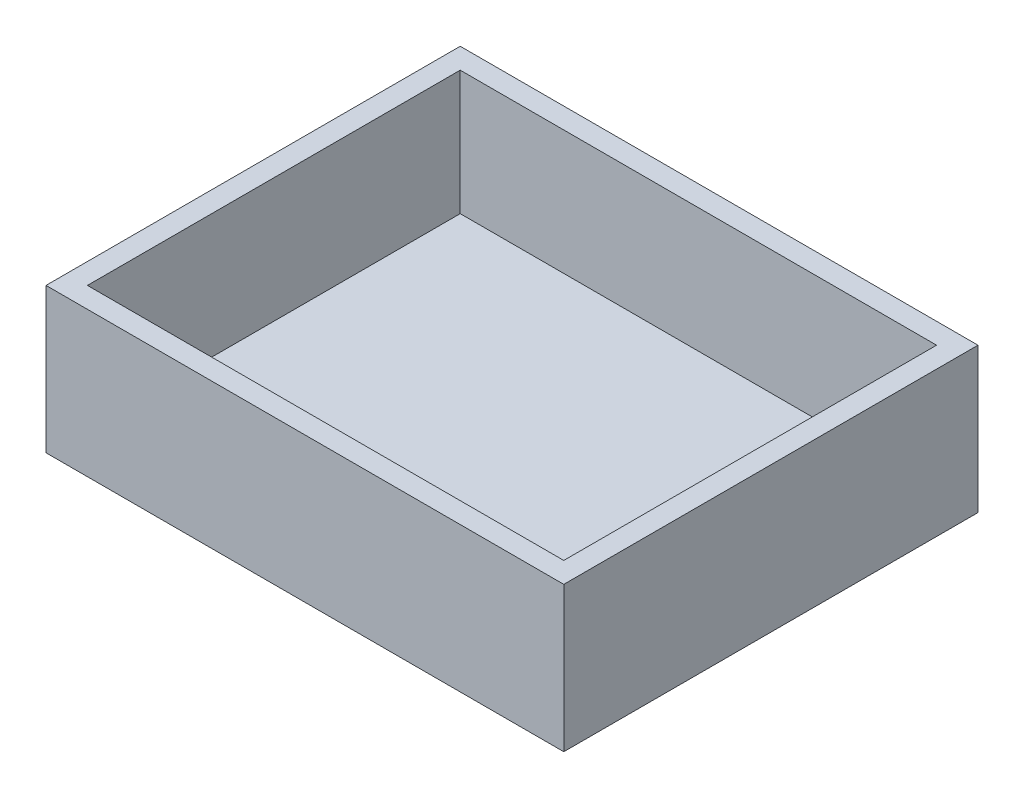
ISO-10303-21;
HEADER;
FILE_DESCRIPTION(('STEP AP214'),'2;1');
FILE_NAME('part.step','',(''),(''),'','','');
FILE_SCHEMA(('AUTOMOTIVE_DESIGN { 1 0 10303 214 1 1 1 1 }'));
ENDSEC;
DATA;
#1=APPLICATION_CONTEXT('core data for automotive mechanical design processes');
#2=APPLICATION_PROTOCOL_DEFINITION('international standard','automotive_design',2000,#1);
#3=PRODUCT_CONTEXT('',#1,'mechanical');
#4=PRODUCT('Part','Part','',(#3));
#5=PRODUCT_RELATED_PRODUCT_CATEGORY('part','',(#4));
#6=PRODUCT_DEFINITION_FORMATION('','',#4);
#7=PRODUCT_DEFINITION_CONTEXT('part definition',#1,'design');
#8=PRODUCT_DEFINITION('design','',#6,#7);
#9=PRODUCT_DEFINITION_SHAPE('','',#8);
#10=(LENGTH_UNIT() NAMED_UNIT(*) SI_UNIT(.MILLI.,.METRE.));
#11=(NAMED_UNIT(*) PLANE_ANGLE_UNIT() SI_UNIT($,.RADIAN.));
#12=(NAMED_UNIT(*) SI_UNIT($,.STERADIAN.) SOLID_ANGLE_UNIT());
#13=UNCERTAINTY_MEASURE_WITH_UNIT(LENGTH_MEASURE(1.E-05),#10,'distance_accuracy_value','');
#14=(GEOMETRIC_REPRESENTATION_CONTEXT(3) GLOBAL_UNCERTAINTY_ASSIGNED_CONTEXT((#13)) GLOBAL_UNIT_ASSIGNED_CONTEXT((#10,
#11,#12)) REPRESENTATION_CONTEXT('',''));
#15=CARTESIAN_POINT('',(0.,0.,0.));
#16=DIRECTION('',(0.,0.,1.));
#17=DIRECTION('',(1.,0.,0.));
#18=AXIS2_PLACEMENT_3D('',#15,#16,#17);
#19=CARTESIAN_POINT('',(125.,10.,-100.));
#20=DIRECTION('',(-1.,0.,0.));
#21=DIRECTION('',(0.,0.,1.));
#22=AXIS2_PLACEMENT_3D('',#19,#20,#21);
#23=PLANE('',#22);
#24=DIRECTION('',(0.,0.,-1.));
#25=VECTOR('',#24,1.);
#26=CARTESIAN_POINT('',(125.,0.,-100.));
#27=LINE('',#26,#25);
#28=CARTESIAN_POINT('',(125.,0.,100.));
#29=VERTEX_POINT('',#28);
#30=CARTESIAN_POINT('',(125.,0.,-100.));
#31=VERTEX_POINT('',#30);
#32=EDGE_CURVE('E173',#29,#31,#27,.T.);
#33=ORIENTED_EDGE('',*,*,#32,.T.);
#34=DIRECTION('',(0.,-1.,0.));
#35=VECTOR('',#34,1.);
#36=CARTESIAN_POINT('',(125.,10.,-100.));
#37=LINE('',#36,#35);
#38=CARTESIAN_POINT('',(125.,70.,-100.));
#39=VERTEX_POINT('',#38);
#40=EDGE_CURVE('E11',#39,#31,#37,.T.);
#41=ORIENTED_EDGE('',*,*,#40,.F.);
#42=DIRECTION('',(0.,0.,-1.));
#43=VECTOR('',#42,1.);
#44=CARTESIAN_POINT('',(125.,70.,-100.));
#45=LINE('',#44,#43);
#46=CARTESIAN_POINT('',(125.,70.,100.));
#47=VERTEX_POINT('',#46);
#48=EDGE_CURVE('E126',#47,#39,#45,.T.);
#49=ORIENTED_EDGE('',*,*,#48,.F.);
#50=DIRECTION('',(0.,-1.,0.));
#51=VECTOR('',#50,1.);
#52=CARTESIAN_POINT('',(125.,10.,100.));
#53=LINE('',#52,#51);
#54=EDGE_CURVE('E186',#47,#29,#53,.T.);
#55=ORIENTED_EDGE('',*,*,#54,.T.);
#56=EDGE_LOOP('',(#33,#41,#49,#55));
#57=FACE_BOUND('',#56,.T.);
#58=ADVANCED_FACE('F45',(#57),#23,.F.);
#59=CARTESIAN_POINT('',(-125.,10.,-100.));
#60=DIRECTION('',(0.,0.,1.));
#61=DIRECTION('',(1.,0.,0.));
#62=AXIS2_PLACEMENT_3D('',#59,#60,#61);
#63=PLANE('',#62);
#64=DIRECTION('',(-1.,0.,0.));
#65=VECTOR('',#64,1.);
#66=CARTESIAN_POINT('',(-125.,0.,-100.));
#67=LINE('',#66,#65);
#68=CARTESIAN_POINT('',(-125.,0.,-100.));
#69=VERTEX_POINT('',#68);
#70=EDGE_CURVE('E177',#31,#69,#67,.T.);
#71=ORIENTED_EDGE('',*,*,#70,.T.);
#72=DIRECTION('',(0.,-1.,0.));
#73=VECTOR('',#72,1.);
#74=CARTESIAN_POINT('',(-125.,10.,-100.));
#75=LINE('',#74,#73);
#76=CARTESIAN_POINT('',(-125.,70.,-100.));
#77=VERTEX_POINT('',#76);
#78=EDGE_CURVE('E53',#77,#69,#75,.T.);
#79=ORIENTED_EDGE('',*,*,#78,.F.);
#80=DIRECTION('',(-1.,0.,0.));
#81=VECTOR('',#80,1.);
#82=CARTESIAN_POINT('',(-125.,70.,-100.));
#83=LINE('',#82,#81);
#84=EDGE_CURVE('E161',#39,#77,#83,.T.);
#85=ORIENTED_EDGE('',*,*,#84,.F.);
#86=ORIENTED_EDGE('',*,*,#40,.T.);
#87=EDGE_LOOP('',(#71,#79,#85,#86));
#88=FACE_BOUND('',#87,.T.);
#89=ADVANCED_FACE('F211',(#88),#63,.F.);
#90=CARTESIAN_POINT('',(-125.,10.,-100.));
#91=DIRECTION('',(1.,0.,0.));
#92=DIRECTION('',(0.,0.,-1.));
#93=AXIS2_PLACEMENT_3D('',#90,#91,#92);
#94=PLANE('',#93);
#95=DIRECTION('',(0.,0.,1.));
#96=VECTOR('',#95,1.);
#97=CARTESIAN_POINT('',(-125.,0.,-100.));
#98=LINE('',#97,#96);
#99=CARTESIAN_POINT('',(-125.,0.,100.));
#100=VERTEX_POINT('',#99);
#101=EDGE_CURVE('E180',#69,#100,#98,.T.);
#102=ORIENTED_EDGE('',*,*,#101,.T.);
#103=DIRECTION('',(0.,-1.,0.));
#104=VECTOR('',#103,1.);
#105=CARTESIAN_POINT('',(-125.,10.,100.));
#106=LINE('',#105,#104);
#107=CARTESIAN_POINT('',(-125.,70.,100.));
#108=VERTEX_POINT('',#107);
#109=EDGE_CURVE('E190',#108,#100,#106,.T.);
#110=ORIENTED_EDGE('',*,*,#109,.F.);
#111=DIRECTION('',(0.,0.,1.));
#112=VECTOR('',#111,1.);
#113=CARTESIAN_POINT('',(-125.,70.,-100.));
#114=LINE('',#113,#112);
#115=EDGE_CURVE('E165',#77,#108,#114,.T.);
#116=ORIENTED_EDGE('',*,*,#115,.F.);
#117=ORIENTED_EDGE('',*,*,#78,.T.);
#118=EDGE_LOOP('',(#102,#110,#116,#117));
#119=FACE_BOUND('',#118,.T.);
#120=ADVANCED_FACE('F198',(#119),#94,.F.);
#121=CARTESIAN_POINT('',(-125.,10.,100.));
#122=DIRECTION('',(0.,0.,-1.));
#123=DIRECTION('',(-1.,0.,0.));
#124=AXIS2_PLACEMENT_3D('',#121,#122,#123);
#125=PLANE('',#124);
#126=DIRECTION('',(1.,0.,0.));
#127=VECTOR('',#126,1.);
#128=CARTESIAN_POINT('',(-125.,0.,100.));
#129=LINE('',#128,#127);
#130=EDGE_CURVE('E183',#100,#29,#129,.T.);
#131=ORIENTED_EDGE('',*,*,#130,.T.);
#132=ORIENTED_EDGE('',*,*,#54,.F.);
#133=DIRECTION('',(1.,0.,0.));
#134=VECTOR('',#133,1.);
#135=CARTESIAN_POINT('',(-125.,70.,100.));
#136=LINE('',#135,#134);
#137=EDGE_CURVE('E169',#108,#47,#136,.T.);
#138=ORIENTED_EDGE('',*,*,#137,.F.);
#139=ORIENTED_EDGE('',*,*,#109,.T.);
#140=EDGE_LOOP('',(#131,#132,#138,#139));
#141=FACE_BOUND('',#140,.T.);
#142=ADVANCED_FACE('F206',(#141),#125,.F.);
#143=CARTESIAN_POINT('',(0.,0.,0.));
#144=DIRECTION('',(0.,1.,0.));
#145=DIRECTION('',(0.,0.,1.));
#146=AXIS2_PLACEMENT_3D('',#143,#144,#145);
#147=PLANE('',#146);
#148=ORIENTED_EDGE('',*,*,#32,.F.);
#149=ORIENTED_EDGE('',*,*,#130,.F.);
#150=ORIENTED_EDGE('',*,*,#101,.F.);
#151=ORIENTED_EDGE('',*,*,#70,.F.);
#152=EDGE_LOOP('',(#148,#149,#150,#151));
#153=FACE_BOUND('',#152,.T.);
#154=ADVANCED_FACE('F204',(#153),#147,.F.);
#155=CARTESIAN_POINT('',(0.,70.,0.));
#156=DIRECTION('',(0.,1.,0.));
#157=DIRECTION('',(0.,0.,1.));
#158=AXIS2_PLACEMENT_3D('',#155,#156,#157);
#159=PLANE('',#158);
#160=ORIENTED_EDGE('',*,*,#48,.T.);
#161=ORIENTED_EDGE('',*,*,#84,.T.);
#162=ORIENTED_EDGE('',*,*,#115,.T.);
#163=ORIENTED_EDGE('',*,*,#137,.T.);
#164=EDGE_LOOP('',(#160,#161,#162,#163));
#165=FACE_BOUND('',#164,.T.);
#166=DIRECTION('',(-1.,0.,0.));
#167=VECTOR('',#166,1.);
#168=CARTESIAN_POINT('',(-115.,70.,-90.));
#169=LINE('',#168,#167);
#170=CARTESIAN_POINT('',(115.,70.,-90.));
#171=VERTEX_POINT('',#170);
#172=CARTESIAN_POINT('',(-115.,70.,-90.));
#173=VERTEX_POINT('',#172);
#174=EDGE_CURVE('E119',#171,#173,#169,.T.);
#175=ORIENTED_EDGE('',*,*,#174,.F.);
#176=DIRECTION('',(0.,0.,-1.));
#177=VECTOR('',#176,1.);
#178=CARTESIAN_POINT('',(115.,70.,-90.));
#179=LINE('',#178,#177);
#180=CARTESIAN_POINT('',(115.,70.,90.));
#181=VERTEX_POINT('',#180);
#182=EDGE_CURVE('E109',#181,#171,#179,.T.);
#183=ORIENTED_EDGE('',*,*,#182,.F.);
#184=DIRECTION('',(1.,0.,0.));
#185=VECTOR('',#184,1.);
#186=CARTESIAN_POINT('',(-115.,70.,90.));
#187=LINE('',#186,#185);
#188=CARTESIAN_POINT('',(-115.,70.,90.));
#189=VERTEX_POINT('',#188);
#190=EDGE_CURVE('E136',#189,#181,#187,.T.);
#191=ORIENTED_EDGE('',*,*,#190,.F.);
#192=DIRECTION('',(0.,0.,1.));
#193=VECTOR('',#192,1.);
#194=CARTESIAN_POINT('',(-115.,70.,-90.));
#195=LINE('',#194,#193);
#196=EDGE_CURVE('E132',#173,#189,#195,.T.);
#197=ORIENTED_EDGE('',*,*,#196,.F.);
#198=EDGE_LOOP('',(#175,#183,#191,#197));
#199=FACE_BOUND('',#198,.T.);
#200=ADVANCED_FACE('F130',(#165,#199),#159,.T.);
#201=CARTESIAN_POINT('',(115.,70.,-90.));
#202=DIRECTION('',(-1.,0.,0.));
#203=DIRECTION('',(0.,0.,1.));
#204=AXIS2_PLACEMENT_3D('',#201,#202,#203);
#205=PLANE('',#204);
#206=DIRECTION('',(0.,0.,-1.));
#207=VECTOR('',#206,1.);
#208=CARTESIAN_POINT('',(115.,10.,-90.));
#209=LINE('',#208,#207);
#210=CARTESIAN_POINT('',(115.,10.,90.));
#211=VERTEX_POINT('',#210);
#212=CARTESIAN_POINT('',(115.,10.,-90.));
#213=VERTEX_POINT('',#212);
#214=EDGE_CURVE('E60',#211,#213,#209,.T.);
#215=ORIENTED_EDGE('',*,*,#214,.F.);
#216=DIRECTION('',(0.,-1.,0.));
#217=VECTOR('',#216,1.);
#218=CARTESIAN_POINT('',(115.,70.,90.));
#219=LINE('',#218,#217);
#220=EDGE_CURVE('E114',#181,#211,#219,.T.);
#221=ORIENTED_EDGE('',*,*,#220,.F.);
#222=ORIENTED_EDGE('',*,*,#182,.T.);
#223=DIRECTION('',(0.,-1.,0.));
#224=VECTOR('',#223,1.);
#225=CARTESIAN_POINT('',(115.,70.,-90.));
#226=LINE('',#225,#224);
#227=EDGE_CURVE('E112',#171,#213,#226,.T.);
#228=ORIENTED_EDGE('',*,*,#227,.T.);
#229=EDGE_LOOP('',(#215,#221,#222,#228));
#230=FACE_BOUND('',#229,.T.);
#231=ADVANCED_FACE('F111',(#230),#205,.T.);
#232=CARTESIAN_POINT('',(-115.,70.,-90.));
#233=DIRECTION('',(0.,0.,1.));
#234=DIRECTION('',(1.,0.,0.));
#235=AXIS2_PLACEMENT_3D('',#232,#233,#234);
#236=PLANE('',#235);
#237=DIRECTION('',(-1.,0.,0.));
#238=VECTOR('',#237,1.);
#239=CARTESIAN_POINT('',(-115.,10.,-90.));
#240=LINE('',#239,#238);
#241=CARTESIAN_POINT('',(-115.,10.,-90.));
#242=VERTEX_POINT('',#241);
#243=EDGE_CURVE('E64',#213,#242,#240,.T.);
#244=ORIENTED_EDGE('',*,*,#243,.F.);
#245=ORIENTED_EDGE('',*,*,#227,.F.);
#246=ORIENTED_EDGE('',*,*,#174,.T.);
#247=DIRECTION('',(0.,-1.,0.));
#248=VECTOR('',#247,1.);
#249=CARTESIAN_POINT('',(-115.,70.,-90.));
#250=LINE('',#249,#248);
#251=EDGE_CURVE('E127',#173,#242,#250,.T.);
#252=ORIENTED_EDGE('',*,*,#251,.T.);
#253=EDGE_LOOP('',(#244,#245,#246,#252));
#254=FACE_BOUND('',#253,.T.);
#255=ADVANCED_FACE('F123',(#254),#236,.T.);
#256=CARTESIAN_POINT('',(-115.,70.,-90.));
#257=DIRECTION('',(1.,0.,0.));
#258=DIRECTION('',(0.,0.,-1.));
#259=AXIS2_PLACEMENT_3D('',#256,#257,#258);
#260=PLANE('',#259);
#261=DIRECTION('',(0.,0.,1.));
#262=VECTOR('',#261,1.);
#263=CARTESIAN_POINT('',(-115.,10.,-90.));
#264=LINE('',#263,#262);
#265=CARTESIAN_POINT('',(-115.,10.,90.));
#266=VERTEX_POINT('',#265);
#267=EDGE_CURVE('E145',#242,#266,#264,.T.);
#268=ORIENTED_EDGE('',*,*,#267,.F.);
#269=ORIENTED_EDGE('',*,*,#251,.F.);
#270=ORIENTED_EDGE('',*,*,#196,.T.);
#271=DIRECTION('',(0.,-1.,0.));
#272=VECTOR('',#271,1.);
#273=CARTESIAN_POINT('',(-115.,70.,90.));
#274=LINE('',#273,#272);
#275=EDGE_CURVE('E152',#189,#266,#274,.T.);
#276=ORIENTED_EDGE('',*,*,#275,.T.);
#277=EDGE_LOOP('',(#268,#269,#270,#276));
#278=FACE_BOUND('',#277,.T.);
#279=ADVANCED_FACE('F233',(#278),#260,.T.);
#280=CARTESIAN_POINT('',(-115.,70.,90.));
#281=DIRECTION('',(0.,0.,-1.));
#282=DIRECTION('',(-1.,0.,0.));
#283=AXIS2_PLACEMENT_3D('',#280,#281,#282);
#284=PLANE('',#283);
#285=DIRECTION('',(1.,0.,0.));
#286=VECTOR('',#285,1.);
#287=CARTESIAN_POINT('',(-115.,10.,90.));
#288=LINE('',#287,#286);
#289=EDGE_CURVE('E120',#266,#211,#288,.T.);
#290=ORIENTED_EDGE('',*,*,#289,.F.);
#291=ORIENTED_EDGE('',*,*,#275,.F.);
#292=ORIENTED_EDGE('',*,*,#190,.T.);
#293=ORIENTED_EDGE('',*,*,#220,.T.);
#294=EDGE_LOOP('',(#290,#291,#292,#293));
#295=FACE_BOUND('',#294,.T.);
#296=ADVANCED_FACE('F226',(#295),#284,.T.);
#297=CARTESIAN_POINT('',(0.,10.,0.));
#298=DIRECTION('',(0.,1.,0.));
#299=DIRECTION('',(0.,0.,1.));
#300=AXIS2_PLACEMENT_3D('',#297,#298,#299);
#301=PLANE('',#300);
#302=ORIENTED_EDGE('',*,*,#214,.T.);
#303=ORIENTED_EDGE('',*,*,#243,.T.);
#304=ORIENTED_EDGE('',*,*,#267,.T.);
#305=ORIENTED_EDGE('',*,*,#289,.T.);
#306=EDGE_LOOP('',(#302,#303,#304,#305));
#307=FACE_BOUND('',#306,.T.);
#308=ADVANCED_FACE('F223',(#307),#301,.T.);
#309=CLOSED_SHELL('',(#58,#89,#120,#142,#154,#200,#231,#255,#279,#296,#308));
#310=MANIFOLD_SOLID_BREP('B2',#309);
#311=ADVANCED_BREP_SHAPE_REPRESENTATION('',(#18,#310),#14);
#312=SHAPE_DEFINITION_REPRESENTATION(#9,#311);
ENDSEC;
END-ISO-10303-21;
